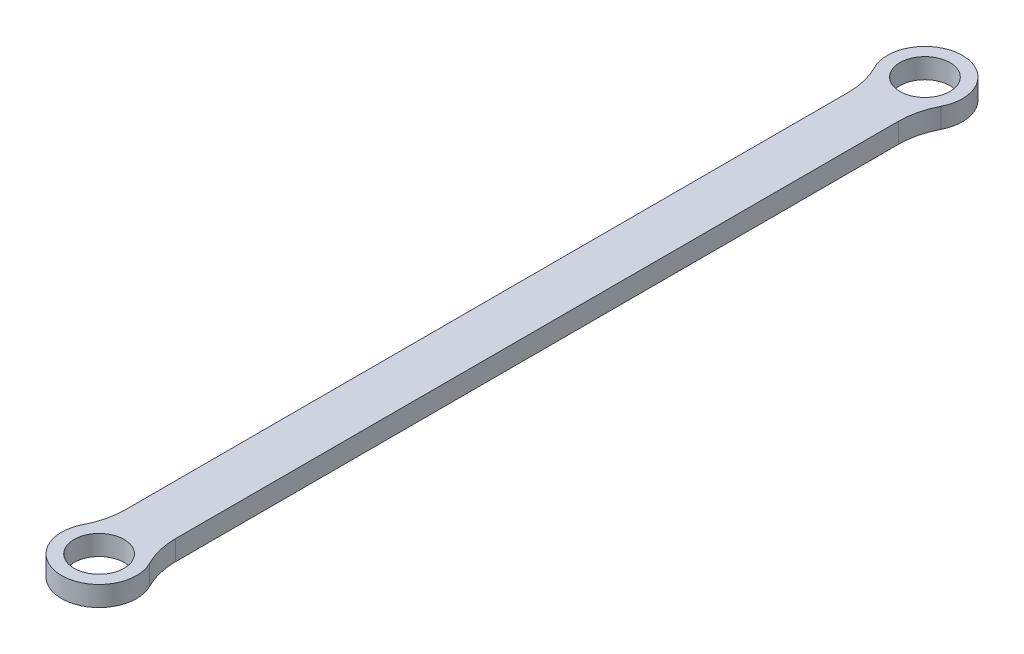
ISO-10303-21;
HEADER;
FILE_DESCRIPTION(('STEP AP214'),'2;1');
FILE_NAME('part.step','',(''),(''),'','','');
FILE_SCHEMA(('AUTOMOTIVE_DESIGN { 1 0 10303 214 1 1 1 1 }'));
ENDSEC;
DATA;
#1=APPLICATION_CONTEXT('core data for automotive mechanical design processes');
#2=APPLICATION_PROTOCOL_DEFINITION('international standard','automotive_design',2000,#1);
#3=PRODUCT_CONTEXT('',#1,'mechanical');
#4=PRODUCT('Part','Part','',(#3));
#5=PRODUCT_RELATED_PRODUCT_CATEGORY('part','',(#4));
#6=PRODUCT_DEFINITION_FORMATION('','',#4);
#7=PRODUCT_DEFINITION_CONTEXT('part definition',#1,'design');
#8=PRODUCT_DEFINITION('design','',#6,#7);
#9=PRODUCT_DEFINITION_SHAPE('','',#8);
#10=(LENGTH_UNIT() NAMED_UNIT(*) SI_UNIT(.MILLI.,.METRE.));
#11=(NAMED_UNIT(*) PLANE_ANGLE_UNIT() SI_UNIT($,.RADIAN.));
#12=(NAMED_UNIT(*) SI_UNIT($,.STERADIAN.) SOLID_ANGLE_UNIT());
#13=UNCERTAINTY_MEASURE_WITH_UNIT(LENGTH_MEASURE(1.E-05),#10,'distance_accuracy_value','');
#14=(GEOMETRIC_REPRESENTATION_CONTEXT(3) GLOBAL_UNCERTAINTY_ASSIGNED_CONTEXT((#13)) GLOBAL_UNIT_ASSIGNED_CONTEXT((#10,
#11,#12)) REPRESENTATION_CONTEXT('',''));
#15=CARTESIAN_POINT('',(0.,0.,0.));
#16=DIRECTION('',(0.,0.,1.));
#17=DIRECTION('',(1.,0.,0.));
#18=AXIS2_PLACEMENT_3D('',#15,#16,#17);
#19=CARTESIAN_POINT('',(0.,4.,82.5));
#20=DIRECTION('',(0.,-1.,0.));
#21=DIRECTION('',(0.,0.,-1.));
#22=AXIS2_PLACEMENT_3D('',#19,#20,#21);
#23=CYLINDRICAL_SURFACE('',#22,5.00000000000001);
#24=CARTESIAN_POINT('',(0.,4.,82.5));
#25=DIRECTION('',(0.,1.,0.));
#26=DIRECTION('',(0.,0.,1.));
#27=AXIS2_PLACEMENT_3D('',#24,#25,#26);
#28=CIRCLE('',#27,5.00000000000001);
#29=CARTESIAN_POINT('',(0.,4.,87.5));
#30=VERTEX_POINT('',#29);
#31=EDGE_CURVE('E143',#30,#30,#28,.T.);
#32=ORIENTED_EDGE('',*,*,#31,.T.);
#33=EDGE_LOOP('',(#32));
#34=FACE_BOUND('',#33,.T.);
#35=CARTESIAN_POINT('',(0.,0.,82.5));
#36=DIRECTION('',(0.,1.,0.));
#37=DIRECTION('',(0.,0.,1.));
#38=AXIS2_PLACEMENT_3D('',#35,#36,#37);
#39=CIRCLE('',#38,5.00000000000001);
#40=CARTESIAN_POINT('',(0.,0.,87.5));
#41=VERTEX_POINT('',#40);
#42=EDGE_CURVE('E140',#41,#41,#39,.T.);
#43=ORIENTED_EDGE('',*,*,#42,.F.);
#44=EDGE_LOOP('',(#43));
#45=FACE_BOUND('',#44,.T.);
#46=ADVANCED_FACE('F58',(#34,#45),#23,.F.);
#47=CARTESIAN_POINT('',(5.,4.,0.));
#48=DIRECTION('',(-1.,0.,0.));
#49=DIRECTION('',(0.,0.,1.));
#50=AXIS2_PLACEMENT_3D('',#47,#48,#49);
#51=PLANE('',#50);
#52=DIRECTION('',(0.,0.,-1.));
#53=VECTOR('',#52,1.);
#54=CARTESIAN_POINT('',(5.,0.,0.));
#55=LINE('',#54,#53);
#56=CARTESIAN_POINT('',(5.,0.,72.1922359359558));
#57=VERTEX_POINT('',#56);
#58=CARTESIAN_POINT('',(5.,0.,-72.1922359359558));
#59=VERTEX_POINT('',#58);
#60=EDGE_CURVE('E141',#57,#59,#55,.T.);
#61=ORIENTED_EDGE('',*,*,#60,.T.);
#62=DIRECTION('',(0.,1.,0.));
#63=VECTOR('',#62,1.);
#64=CARTESIAN_POINT('',(5.,4.,-72.1922359359558));
#65=LINE('',#64,#63);
#66=CARTESIAN_POINT('',(5.,4.,-72.1922359359558));
#67=VERTEX_POINT('',#66);
#68=EDGE_CURVE('E161',#59,#67,#65,.T.);
#69=ORIENTED_EDGE('',*,*,#68,.T.);
#70=DIRECTION('',(0.,0.,-1.));
#71=VECTOR('',#70,1.);
#72=CARTESIAN_POINT('',(5.,4.,0.));
#73=LINE('',#72,#71);
#74=CARTESIAN_POINT('',(5.,4.,72.1922359359558));
#75=VERTEX_POINT('',#74);
#76=EDGE_CURVE('E181',#75,#67,#73,.T.);
#77=ORIENTED_EDGE('',*,*,#76,.F.);
#78=DIRECTION('',(0.,1.,0.));
#79=VECTOR('',#78,1.);
#80=CARTESIAN_POINT('',(5.,0.,72.1922359359558));
#81=LINE('',#80,#79);
#82=EDGE_CURVE('E158',#75,#57,#81,.F.);
#83=ORIENTED_EDGE('',*,*,#82,.T.);
#84=EDGE_LOOP('',(#61,#69,#77,#83));
#85=FACE_BOUND('',#84,.T.);
#86=ADVANCED_FACE('F188',(#85),#51,.F.);
#87=CARTESIAN_POINT('',(-5.,4.,0.));
#88=DIRECTION('',(-1.,0.,0.));
#89=DIRECTION('',(0.,0.,1.));
#90=AXIS2_PLACEMENT_3D('',#87,#88,#89);
#91=PLANE('',#90);
#92=DIRECTION('',(0.,0.,-1.));
#93=VECTOR('',#92,1.);
#94=CARTESIAN_POINT('',(-5.,4.,0.));
#95=LINE('',#94,#93);
#96=CARTESIAN_POINT('',(-5.,4.,72.1922359359558));
#97=VERTEX_POINT('',#96);
#98=CARTESIAN_POINT('',(-5.,4.,-72.1922359359558));
#99=VERTEX_POINT('',#98);
#100=EDGE_CURVE('E148',#97,#99,#95,.T.);
#101=ORIENTED_EDGE('',*,*,#100,.T.);
#102=DIRECTION('',(0.,-1.,0.));
#103=VECTOR('',#102,1.);
#104=CARTESIAN_POINT('',(-5.,4.,-72.1922359359558));
#105=LINE('',#104,#103);
#106=CARTESIAN_POINT('',(-5.,0.,-72.1922359359558));
#107=VERTEX_POINT('',#106);
#108=EDGE_CURVE('E139',#99,#107,#105,.T.);
#109=ORIENTED_EDGE('',*,*,#108,.T.);
#110=DIRECTION('',(0.,0.,-1.));
#111=VECTOR('',#110,1.);
#112=CARTESIAN_POINT('',(-5.,0.,0.));
#113=LINE('',#112,#111);
#114=CARTESIAN_POINT('',(-5.,0.,72.1922359359558));
#115=VERTEX_POINT('',#114);
#116=EDGE_CURVE('E126',#115,#107,#113,.T.);
#117=ORIENTED_EDGE('',*,*,#116,.F.);
#118=DIRECTION('',(0.,-1.,0.));
#119=VECTOR('',#118,1.);
#120=CARTESIAN_POINT('',(-5.,4.,72.1922359359558));
#121=LINE('',#120,#119);
#122=EDGE_CURVE('E137',#115,#97,#121,.F.);
#123=ORIENTED_EDGE('',*,*,#122,.T.);
#124=EDGE_LOOP('',(#101,#109,#117,#123));
#125=FACE_BOUND('',#124,.T.);
#126=ADVANCED_FACE('F136',(#125),#91,.T.);
#127=CARTESIAN_POINT('',(0.,4.,82.5));
#128=DIRECTION('',(0.,-1.,0.));
#129=DIRECTION('',(0.,0.,-1.));
#130=AXIS2_PLACEMENT_3D('',#127,#128,#129);
#131=CYLINDRICAL_SURFACE('',#130,7.50000000000001);
#132=CARTESIAN_POINT('',(0.,0.,82.5));
#133=DIRECTION('',(0.,1.,0.));
#134=DIRECTION('',(0.,0.,1.));
#135=AXIS2_PLACEMENT_3D('',#132,#133,#134);
#136=CIRCLE('',#135,7.50000000000001);
#137=CARTESIAN_POINT('',(-6.66666666666667,0.,79.0640786453186));
#138=VERTEX_POINT('',#137);
#139=CARTESIAN_POINT('',(6.66666666666667,0.,79.0640786453186));
#140=VERTEX_POINT('',#139);
#141=EDGE_CURVE('E127',#138,#140,#136,.T.);
#142=ORIENTED_EDGE('',*,*,#141,.T.);
#143=DIRECTION('',(0.,-1.,0.));
#144=VECTOR('',#143,1.);
#145=CARTESIAN_POINT('',(6.66666666666667,4.,79.0640786453186));
#146=LINE('',#145,#144);
#147=CARTESIAN_POINT('',(6.66666666666667,4.,79.0640786453186));
#148=VERTEX_POINT('',#147);
#149=EDGE_CURVE('E73',#140,#148,#146,.F.);
#150=ORIENTED_EDGE('',*,*,#149,.T.);
#151=CARTESIAN_POINT('',(0.,4.,82.5));
#152=DIRECTION('',(0.,1.,0.));
#153=DIRECTION('',(0.,0.,1.));
#154=AXIS2_PLACEMENT_3D('',#151,#152,#153);
#155=CIRCLE('',#154,7.50000000000001);
#156=CARTESIAN_POINT('',(-6.66666666666667,4.,79.0640786453186));
#157=VERTEX_POINT('',#156);
#158=EDGE_CURVE('E183',#157,#148,#155,.T.);
#159=ORIENTED_EDGE('',*,*,#158,.F.);
#160=DIRECTION('',(0.,-1.,0.));
#161=VECTOR('',#160,1.);
#162=CARTESIAN_POINT('',(-6.66666666666667,4.,79.0640786453186));
#163=LINE('',#162,#161);
#164=EDGE_CURVE('E163',#157,#138,#163,.T.);
#165=ORIENTED_EDGE('',*,*,#164,.T.);
#166=EDGE_LOOP('',(#142,#150,#159,#165));
#167=FACE_BOUND('',#166,.T.);
#168=ADVANCED_FACE('F193',(#167),#131,.T.);
#169=CARTESIAN_POINT('',(0.,0.,0.));
#170=DIRECTION('',(0.,1.,0.));
#171=DIRECTION('',(0.,0.,1.));
#172=AXIS2_PLACEMENT_3D('',#169,#170,#171);
#173=PLANE('',#172);
#174=ORIENTED_EDGE('',*,*,#141,.F.);
#175=CARTESIAN_POINT('',(-20.,0.,72.1922359359558));
#176=DIRECTION('',(0.,1.,0.));
#177=DIRECTION('',(0.,0.,1.));
#178=AXIS2_PLACEMENT_3D('',#175,#176,#177);
#179=CIRCLE('',#178,15.);
#180=EDGE_CURVE('E66',#138,#115,#179,.T.);
#181=ORIENTED_EDGE('',*,*,#180,.T.);
#182=ORIENTED_EDGE('',*,*,#116,.T.);
#183=CARTESIAN_POINT('',(-20.,0.,-72.1922359359558));
#184=DIRECTION('',(0.,1.,0.));
#185=DIRECTION('',(0.,0.,1.));
#186=AXIS2_PLACEMENT_3D('',#183,#184,#185);
#187=CIRCLE('',#186,15.);
#188=CARTESIAN_POINT('',(-6.66666666666667,0.,-79.0640786453186));
#189=VERTEX_POINT('',#188);
#190=EDGE_CURVE('E166',#107,#189,#187,.T.);
#191=ORIENTED_EDGE('',*,*,#190,.T.);
#192=CARTESIAN_POINT('',(0.,0.,-82.5));
#193=DIRECTION('',(0.,1.,0.));
#194=DIRECTION('',(0.,0.,1.));
#195=AXIS2_PLACEMENT_3D('',#192,#193,#194);
#196=CIRCLE('',#195,7.50000000000001);
#197=CARTESIAN_POINT('',(6.66666666666667,0.,-79.0640786453186));
#198=VERTEX_POINT('',#197);
#199=EDGE_CURVE('E151',#198,#189,#196,.T.);
#200=ORIENTED_EDGE('',*,*,#199,.F.);
#201=CARTESIAN_POINT('',(20.,0.,-72.1922359359558));
#202=DIRECTION('',(0.,1.,0.));
#203=DIRECTION('',(0.,0.,1.));
#204=AXIS2_PLACEMENT_3D('',#201,#202,#203);
#205=CIRCLE('',#204,15.);
#206=EDGE_CURVE('E170',#198,#59,#205,.T.);
#207=ORIENTED_EDGE('',*,*,#206,.T.);
#208=ORIENTED_EDGE('',*,*,#60,.F.);
#209=CARTESIAN_POINT('',(20.,0.,72.1922359359558));
#210=DIRECTION('',(0.,1.,0.));
#211=DIRECTION('',(0.,0.,1.));
#212=AXIS2_PLACEMENT_3D('',#209,#210,#211);
#213=CIRCLE('',#212,15.);
#214=EDGE_CURVE('E174',#57,#140,#213,.T.);
#215=ORIENTED_EDGE('',*,*,#214,.T.);
#216=EDGE_LOOP('',(#174,#181,#182,#191,#200,#207,#208,#215));
#217=FACE_BOUND('',#216,.T.);
#218=ORIENTED_EDGE('',*,*,#42,.T.);
#219=EDGE_LOOP('',(#218));
#220=FACE_BOUND('',#219,.T.);
#221=CARTESIAN_POINT('',(0.,0.,-82.5));
#222=DIRECTION('',(0.,1.,0.));
#223=DIRECTION('',(0.,0.,1.));
#224=AXIS2_PLACEMENT_3D('',#221,#222,#223);
#225=CIRCLE('',#224,5.00000000000001);
#226=CARTESIAN_POINT('',(0.,0.,-77.5));
#227=VERTEX_POINT('',#226);
#228=EDGE_CURVE('E205',#227,#227,#225,.T.);
#229=ORIENTED_EDGE('',*,*,#228,.T.);
#230=EDGE_LOOP('',(#229));
#231=FACE_BOUND('',#230,.T.);
#232=ADVANCED_FACE('F124',(#217,#220,#231),#173,.F.);
#233=CARTESIAN_POINT('',(0.,4.,0.));
#234=DIRECTION('',(0.,1.,0.));
#235=DIRECTION('',(0.,0.,1.));
#236=AXIS2_PLACEMENT_3D('',#233,#234,#235);
#237=PLANE('',#236);
#238=ORIENTED_EDGE('',*,*,#100,.F.);
#239=CARTESIAN_POINT('',(-20.,4.,72.1922359359558));
#240=DIRECTION('',(0.,1.,0.));
#241=DIRECTION('',(0.,0.,1.));
#242=AXIS2_PLACEMENT_3D('',#239,#240,#241);
#243=CIRCLE('',#242,15.);
#244=EDGE_CURVE('E12',#97,#157,#243,.F.);
#245=ORIENTED_EDGE('',*,*,#244,.T.);
#246=ORIENTED_EDGE('',*,*,#158,.T.);
#247=CARTESIAN_POINT('',(20.,4.,72.1922359359558));
#248=DIRECTION('',(0.,1.,0.));
#249=DIRECTION('',(0.,0.,1.));
#250=AXIS2_PLACEMENT_3D('',#247,#248,#249);
#251=CIRCLE('',#250,15.);
#252=EDGE_CURVE('E132',#148,#75,#251,.F.);
#253=ORIENTED_EDGE('',*,*,#252,.T.);
#254=ORIENTED_EDGE('',*,*,#76,.T.);
#255=CARTESIAN_POINT('',(20.,4.,-72.1922359359558));
#256=DIRECTION('',(0.,1.,0.));
#257=DIRECTION('',(0.,0.,1.));
#258=AXIS2_PLACEMENT_3D('',#255,#256,#257);
#259=CIRCLE('',#258,15.);
#260=CARTESIAN_POINT('',(6.66666666666667,4.,-79.0640786453186));
#261=VERTEX_POINT('',#260);
#262=EDGE_CURVE('E172',#67,#261,#259,.F.);
#263=ORIENTED_EDGE('',*,*,#262,.T.);
#264=CARTESIAN_POINT('',(0.,4.,-82.5));
#265=DIRECTION('',(0.,1.,0.));
#266=DIRECTION('',(0.,0.,1.));
#267=AXIS2_PLACEMENT_3D('',#264,#265,#266);
#268=CIRCLE('',#267,7.50000000000001);
#269=CARTESIAN_POINT('',(-6.66666666666667,4.,-79.0640786453186));
#270=VERTEX_POINT('',#269);
#271=EDGE_CURVE('E194',#261,#270,#268,.T.);
#272=ORIENTED_EDGE('',*,*,#271,.T.);
#273=CARTESIAN_POINT('',(-20.,4.,-72.1922359359558));
#274=DIRECTION('',(0.,1.,0.));
#275=DIRECTION('',(0.,0.,1.));
#276=AXIS2_PLACEMENT_3D('',#273,#274,#275);
#277=CIRCLE('',#276,15.);
#278=EDGE_CURVE('E168',#270,#99,#277,.F.);
#279=ORIENTED_EDGE('',*,*,#278,.T.);
#280=EDGE_LOOP('',(#238,#245,#246,#253,#254,#263,#272,#279));
#281=FACE_BOUND('',#280,.T.);
#282=ORIENTED_EDGE('',*,*,#31,.F.);
#283=EDGE_LOOP('',(#282));
#284=FACE_BOUND('',#283,.T.);
#285=CARTESIAN_POINT('',(0.,4.,-82.5));
#286=DIRECTION('',(0.,1.,0.));
#287=DIRECTION('',(0.,0.,1.));
#288=AXIS2_PLACEMENT_3D('',#285,#286,#287);
#289=CIRCLE('',#288,5.00000000000001);
#290=CARTESIAN_POINT('',(0.,4.,-77.5));
#291=VERTEX_POINT('',#290);
#292=EDGE_CURVE('E202',#291,#291,#289,.T.);
#293=ORIENTED_EDGE('',*,*,#292,.F.);
#294=EDGE_LOOP('',(#293));
#295=FACE_BOUND('',#294,.T.);
#296=ADVANCED_FACE('F179',(#281,#284,#295),#237,.T.);
#297=CARTESIAN_POINT('',(0.,4.,-82.5));
#298=DIRECTION('',(0.,-1.,0.));
#299=DIRECTION('',(0.,0.,-1.));
#300=AXIS2_PLACEMENT_3D('',#297,#298,#299);
#301=CYLINDRICAL_SURFACE('',#300,5.00000000000001);
#302=ORIENTED_EDGE('',*,*,#292,.T.);
#303=EDGE_LOOP('',(#302));
#304=FACE_BOUND('',#303,.T.);
#305=ORIENTED_EDGE('',*,*,#228,.F.);
#306=EDGE_LOOP('',(#305));
#307=FACE_BOUND('',#306,.T.);
#308=ADVANCED_FACE('F210',(#304,#307),#301,.F.);
#309=CARTESIAN_POINT('',(0.,4.,-82.5));
#310=DIRECTION('',(0.,-1.,0.));
#311=DIRECTION('',(0.,0.,-1.));
#312=AXIS2_PLACEMENT_3D('',#309,#310,#311);
#313=CYLINDRICAL_SURFACE('',#312,7.50000000000001);
#314=ORIENTED_EDGE('',*,*,#199,.T.);
#315=DIRECTION('',(0.,-1.,0.));
#316=VECTOR('',#315,1.);
#317=CARTESIAN_POINT('',(-6.66666666666667,4.,-79.0640786453186));
#318=LINE('',#317,#316);
#319=EDGE_CURVE('E156',#189,#270,#318,.F.);
#320=ORIENTED_EDGE('',*,*,#319,.T.);
#321=ORIENTED_EDGE('',*,*,#271,.F.);
#322=DIRECTION('',(0.,-1.,0.));
#323=VECTOR('',#322,1.);
#324=CARTESIAN_POINT('',(6.66666666666667,4.,-79.0640786453186));
#325=LINE('',#324,#323);
#326=EDGE_CURVE('E145',#261,#198,#325,.T.);
#327=ORIENTED_EDGE('',*,*,#326,.T.);
#328=EDGE_LOOP('',(#314,#320,#321,#327));
#329=FACE_BOUND('',#328,.T.);
#330=ADVANCED_FACE('F212',(#329),#313,.T.);
#331=CARTESIAN_POINT('',(-20.,4.,-72.1922359359558));
#332=DIRECTION('',(0.,-1.,0.));
#333=DIRECTION('',(0.,0.,-1.));
#334=AXIS2_PLACEMENT_3D('',#331,#332,#333);
#335=CYLINDRICAL_SURFACE('',#334,15.);
#336=ORIENTED_EDGE('',*,*,#278,.F.);
#337=ORIENTED_EDGE('',*,*,#319,.F.);
#338=ORIENTED_EDGE('',*,*,#190,.F.);
#339=ORIENTED_EDGE('',*,*,#108,.F.);
#340=EDGE_LOOP('',(#336,#337,#338,#339));
#341=FACE_BOUND('',#340,.T.);
#342=ADVANCED_FACE('F215',(#341),#335,.F.);
#343=CARTESIAN_POINT('',(20.,4.,-72.1922359359558));
#344=DIRECTION('',(0.,-1.,0.));
#345=DIRECTION('',(0.,0.,-1.));
#346=AXIS2_PLACEMENT_3D('',#343,#344,#345);
#347=CYLINDRICAL_SURFACE('',#346,15.);
#348=ORIENTED_EDGE('',*,*,#262,.F.);
#349=ORIENTED_EDGE('',*,*,#68,.F.);
#350=ORIENTED_EDGE('',*,*,#206,.F.);
#351=ORIENTED_EDGE('',*,*,#326,.F.);
#352=EDGE_LOOP('',(#348,#349,#350,#351));
#353=FACE_BOUND('',#352,.T.);
#354=ADVANCED_FACE('F225',(#353),#347,.F.);
#355=CARTESIAN_POINT('',(20.,4.,72.1922359359558));
#356=DIRECTION('',(0.,-1.,0.));
#357=DIRECTION('',(0.,0.,-1.));
#358=AXIS2_PLACEMENT_3D('',#355,#356,#357);
#359=CYLINDRICAL_SURFACE('',#358,15.);
#360=ORIENTED_EDGE('',*,*,#252,.F.);
#361=ORIENTED_EDGE('',*,*,#149,.F.);
#362=ORIENTED_EDGE('',*,*,#214,.F.);
#363=ORIENTED_EDGE('',*,*,#82,.F.);
#364=EDGE_LOOP('',(#360,#361,#362,#363));
#365=FACE_BOUND('',#364,.T.);
#366=ADVANCED_FACE('F192',(#365),#359,.F.);
#367=CARTESIAN_POINT('',(-20.,4.,72.1922359359558));
#368=DIRECTION('',(0.,-1.,0.));
#369=DIRECTION('',(0.,0.,-1.));
#370=AXIS2_PLACEMENT_3D('',#367,#368,#369);
#371=CYLINDRICAL_SURFACE('',#370,15.);
#372=ORIENTED_EDGE('',*,*,#244,.F.);
#373=ORIENTED_EDGE('',*,*,#122,.F.);
#374=ORIENTED_EDGE('',*,*,#180,.F.);
#375=ORIENTED_EDGE('',*,*,#164,.F.);
#376=EDGE_LOOP('',(#372,#373,#374,#375));
#377=FACE_BOUND('',#376,.T.);
#378=ADVANCED_FACE('F60',(#377),#371,.F.);
#379=CLOSED_SHELL('',(#46,#86,#126,#168,#232,#296,#308,#330,#342,#354,#366,#378));
#380=MANIFOLD_SOLID_BREP('B2',#379);
#381=ADVANCED_BREP_SHAPE_REPRESENTATION('',(#18,#380),#14);
#382=SHAPE_DEFINITION_REPRESENTATION(#9,#381);
ENDSEC;
END-ISO-10303-21;
